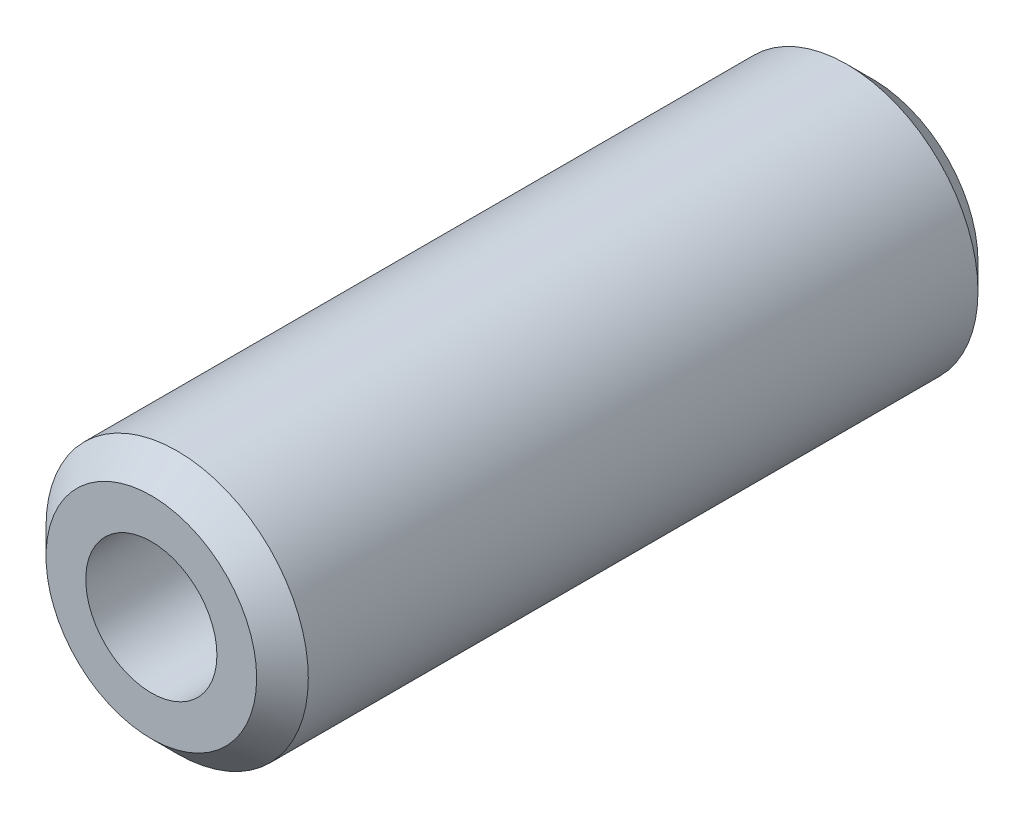
ISO-10303-21;
HEADER;
FILE_DESCRIPTION(('STEP AP214'),'2;1');
FILE_NAME('part.step','',(''),(''),'','','');
FILE_SCHEMA(('AUTOMOTIVE_DESIGN { 1 0 10303 214 1 1 1 1 }'));
ENDSEC;
DATA;
#1=APPLICATION_CONTEXT('core data for automotive mechanical design processes');
#2=APPLICATION_PROTOCOL_DEFINITION('international standard','automotive_design',2000,#1);
#3=PRODUCT_CONTEXT('',#1,'mechanical');
#4=PRODUCT('Part','Part','',(#3));
#5=PRODUCT_RELATED_PRODUCT_CATEGORY('part','',(#4));
#6=PRODUCT_DEFINITION_FORMATION('','',#4);
#7=PRODUCT_DEFINITION_CONTEXT('part definition',#1,'design');
#8=PRODUCT_DEFINITION('design','',#6,#7);
#9=PRODUCT_DEFINITION_SHAPE('','',#8);
#10=(LENGTH_UNIT() NAMED_UNIT(*) SI_UNIT(.MILLI.,.METRE.));
#11=(NAMED_UNIT(*) PLANE_ANGLE_UNIT() SI_UNIT($,.RADIAN.));
#12=(NAMED_UNIT(*) SI_UNIT($,.STERADIAN.) SOLID_ANGLE_UNIT());
#13=UNCERTAINTY_MEASURE_WITH_UNIT(LENGTH_MEASURE(1.E-05),#10,'distance_accuracy_value','');
#14=(GEOMETRIC_REPRESENTATION_CONTEXT(3) GLOBAL_UNCERTAINTY_ASSIGNED_CONTEXT((#13)) GLOBAL_UNIT_ASSIGNED_CONTEXT((#10,
#11,#12)) REPRESENTATION_CONTEXT('',''));
#15=CARTESIAN_POINT('',(0.,0.,0.));
#16=DIRECTION('',(0.,0.,1.));
#17=DIRECTION('',(1.,0.,0.));
#18=AXIS2_PLACEMENT_3D('',#15,#16,#17);
#19=CARTESIAN_POINT('',(0.,0.,34.925));
#20=DIRECTION('',(0.,0.,1.));
#21=DIRECTION('',(1.,0.,0.));
#22=AXIS2_PLACEMENT_3D('',#19,#20,#21);
#23=PLANE('',#22);
#24=CARTESIAN_POINT('',(0.,0.,34.925));
#25=DIRECTION('',(0.,0.,1.));
#26=DIRECTION('',(1.,0.,0.));
#27=AXIS2_PLACEMENT_3D('',#24,#25,#26);
#28=CIRCLE('',#27,10.2);
#29=CARTESIAN_POINT('',(10.2,0.,34.925));
#30=VERTEX_POINT('',#29);
#31=EDGE_CURVE('E10',#30,#30,#28,.T.);
#32=ORIENTED_EDGE('',*,*,#31,.T.);
#33=EDGE_LOOP('',(#32));
#34=FACE_BOUND('',#33,.T.);
#35=CARTESIAN_POINT('',(0.,0.,34.925));
#36=DIRECTION('',(0.,0.,1.));
#37=DIRECTION('',(1.,0.,0.));
#38=AXIS2_PLACEMENT_3D('',#35,#36,#37);
#39=CIRCLE('',#38,6.35);
#40=CARTESIAN_POINT('',(6.35,0.,34.925));
#41=VERTEX_POINT('',#40);
#42=EDGE_CURVE('E53',#41,#41,#39,.T.);
#43=ORIENTED_EDGE('',*,*,#42,.F.);
#44=EDGE_LOOP('',(#43));
#45=FACE_BOUND('',#44,.T.);
#46=ADVANCED_FACE('F32',(#34,#45),#23,.T.);
#47=CARTESIAN_POINT('',(0.,0.,-34.925));
#48=DIRECTION('',(0.,0.,1.));
#49=DIRECTION('',(1.,0.,0.));
#50=AXIS2_PLACEMENT_3D('',#47,#48,#49);
#51=PLANE('',#50);
#52=CARTESIAN_POINT('',(0.,0.,-34.925));
#53=DIRECTION('',(0.,0.,1.));
#54=DIRECTION('',(1.,0.,0.));
#55=AXIS2_PLACEMENT_3D('',#52,#53,#54);
#56=CIRCLE('',#55,10.2);
#57=CARTESIAN_POINT('',(10.2,0.,-34.925));
#58=VERTEX_POINT('',#57);
#59=EDGE_CURVE('E40',#58,#58,#56,.F.);
#60=ORIENTED_EDGE('',*,*,#59,.T.);
#61=EDGE_LOOP('',(#60));
#62=FACE_BOUND('',#61,.T.);
#63=CARTESIAN_POINT('',(0.,0.,-34.925));
#64=DIRECTION('',(0.,0.,1.));
#65=DIRECTION('',(1.,0.,0.));
#66=AXIS2_PLACEMENT_3D('',#63,#64,#65);
#67=CIRCLE('',#66,6.35);
#68=CARTESIAN_POINT('',(6.35,0.,-34.925));
#69=VERTEX_POINT('',#68);
#70=EDGE_CURVE('E54',#69,#69,#67,.T.);
#71=ORIENTED_EDGE('',*,*,#70,.T.);
#72=EDGE_LOOP('',(#71));
#73=FACE_BOUND('',#72,.T.);
#74=ADVANCED_FACE('F64',(#62,#73),#51,.F.);
#75=CARTESIAN_POINT('',(0.,0.,34.925));
#76=DIRECTION('',(0.,0.,-1.));
#77=DIRECTION('',(-1.,0.,0.));
#78=AXIS2_PLACEMENT_3D('',#75,#76,#77);
#79=CYLINDRICAL_SURFACE('',#78,12.7);
#80=CARTESIAN_POINT('',(0.,0.,-32.425));
#81=DIRECTION('',(0.,0.,1.));
#82=DIRECTION('',(1.,0.,0.));
#83=AXIS2_PLACEMENT_3D('',#80,#81,#82);
#84=CIRCLE('',#83,12.7);
#85=CARTESIAN_POINT('',(12.7,0.,-32.425));
#86=VERTEX_POINT('',#85);
#87=EDGE_CURVE('E44',#86,#86,#84,.T.);
#88=ORIENTED_EDGE('',*,*,#87,.T.);
#89=EDGE_LOOP('',(#88));
#90=FACE_BOUND('',#89,.T.);
#91=CARTESIAN_POINT('',(0.,0.,32.425));
#92=DIRECTION('',(0.,0.,1.));
#93=DIRECTION('',(1.,0.,0.));
#94=AXIS2_PLACEMENT_3D('',#91,#92,#93);
#95=CIRCLE('',#94,12.7);
#96=CARTESIAN_POINT('',(12.7,0.,32.425));
#97=VERTEX_POINT('',#96);
#98=EDGE_CURVE('E48',#97,#97,#95,.F.);
#99=ORIENTED_EDGE('',*,*,#98,.T.);
#100=EDGE_LOOP('',(#99));
#101=FACE_BOUND('',#100,.T.);
#102=ADVANCED_FACE('F69',(#90,#101),#79,.T.);
#103=CARTESIAN_POINT('',(0.,0.,34.925));
#104=DIRECTION('',(0.,0.,-1.));
#105=DIRECTION('',(-1.,0.,0.));
#106=AXIS2_PLACEMENT_3D('',#103,#104,#105);
#107=CYLINDRICAL_SURFACE('',#106,6.35);
#108=ORIENTED_EDGE('',*,*,#42,.T.);
#109=EDGE_LOOP('',(#108));
#110=FACE_BOUND('',#109,.T.);
#111=ORIENTED_EDGE('',*,*,#70,.F.);
#112=EDGE_LOOP('',(#111));
#113=FACE_BOUND('',#112,.T.);
#114=ADVANCED_FACE('F60',(#110,#113),#107,.F.);
#115=CARTESIAN_POINT('',(0.,0.,-32.425));
#116=DIRECTION('',(0.,0.,1.));
#117=DIRECTION('',(1.,0.,0.));
#118=AXIS2_PLACEMENT_3D('',#115,#116,#117);
#119=CONICAL_SURFACE('',#118,12.7,0.785398163397449);
#120=ORIENTED_EDGE('',*,*,#59,.F.);
#121=EDGE_LOOP('',(#120));
#122=FACE_BOUND('',#121,.T.);
#123=ORIENTED_EDGE('',*,*,#87,.F.);
#124=EDGE_LOOP('',(#123));
#125=FACE_BOUND('',#124,.T.);
#126=ADVANCED_FACE('F76',(#122,#125),#119,.T.);
#127=CARTESIAN_POINT('',(0.,0.,34.925));
#128=DIRECTION('',(0.,0.,-1.));
#129=DIRECTION('',(-1.,0.,0.));
#130=AXIS2_PLACEMENT_3D('',#127,#128,#129);
#131=CONICAL_SURFACE('',#130,10.2,0.785398163397446);
#132=ORIENTED_EDGE('',*,*,#98,.F.);
#133=EDGE_LOOP('',(#132));
#134=FACE_BOUND('',#133,.T.);
#135=ORIENTED_EDGE('',*,*,#31,.F.);
#136=EDGE_LOOP('',(#135));
#137=FACE_BOUND('',#136,.T.);
#138=ADVANCED_FACE('F35',(#134,#137),#131,.T.);
#139=CLOSED_SHELL('',(#46,#74,#102,#114,#126,#138));
#140=MANIFOLD_SOLID_BREP('B2',#139);
#141=ADVANCED_BREP_SHAPE_REPRESENTATION('',(#18,#140),#14);
#142=SHAPE_DEFINITION_REPRESENTATION(#9,#141);
ENDSEC;
END-ISO-10303-21;
